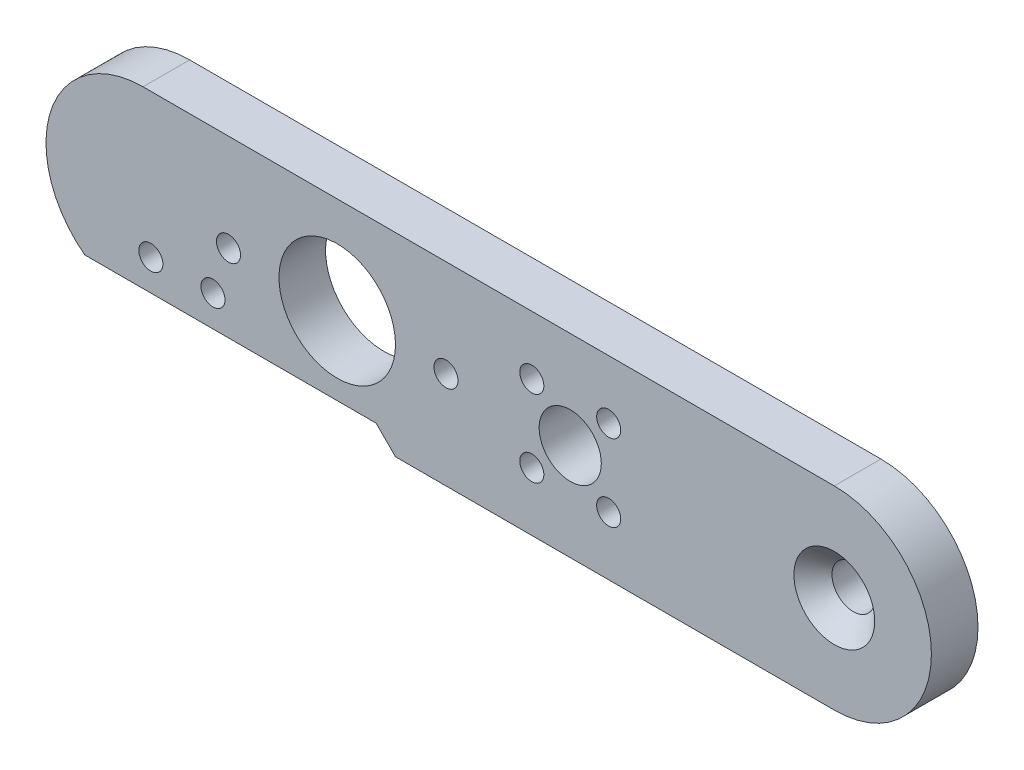
ISO-10303-21;
HEADER;
FILE_DESCRIPTION(('STEP AP214'),'2;1');
FILE_NAME('part.step','',(''),(''),'','','');
FILE_SCHEMA(('AUTOMOTIVE_DESIGN { 1 0 10303 214 1 1 1 1 }'));
ENDSEC;
DATA;
#1=APPLICATION_CONTEXT('core data for automotive mechanical design processes');
#2=APPLICATION_PROTOCOL_DEFINITION('international standard','automotive_design',2000,#1);
#3=PRODUCT_CONTEXT('',#1,'mechanical');
#4=PRODUCT('Part','Part','',(#3));
#5=PRODUCT_RELATED_PRODUCT_CATEGORY('part','',(#4));
#6=PRODUCT_DEFINITION_FORMATION('','',#4);
#7=PRODUCT_DEFINITION_CONTEXT('part definition',#1,'design');
#8=PRODUCT_DEFINITION('design','',#6,#7);
#9=PRODUCT_DEFINITION_SHAPE('','',#8);
#10=(LENGTH_UNIT() NAMED_UNIT(*) SI_UNIT(.MILLI.,.METRE.));
#11=(NAMED_UNIT(*) PLANE_ANGLE_UNIT() SI_UNIT($,.RADIAN.));
#12=(NAMED_UNIT(*) SI_UNIT($,.STERADIAN.) SOLID_ANGLE_UNIT());
#13=UNCERTAINTY_MEASURE_WITH_UNIT(LENGTH_MEASURE(1.E-05),#10,'distance_accuracy_value','');
#14=(GEOMETRIC_REPRESENTATION_CONTEXT(3) GLOBAL_UNCERTAINTY_ASSIGNED_CONTEXT((#13)) GLOBAL_UNIT_ASSIGNED_CONTEXT((#10,
#11,#12)) REPRESENTATION_CONTEXT('',''));
#15=CARTESIAN_POINT('',(0.,0.,0.));
#16=DIRECTION('',(0.,0.,1.));
#17=DIRECTION('',(1.,0.,0.));
#18=AXIS2_PLACEMENT_3D('',#15,#16,#17);
#19=CARTESIAN_POINT('',(-35.5,-5.99999999999998,0.));
#20=DIRECTION('',(0.,0.,1.));
#21=DIRECTION('',(1.,0.,0.));
#22=AXIS2_PLACEMENT_3D('',#19,#20,#21);
#23=CYLINDRICAL_SURFACE('',#22,1.55);
#24=CARTESIAN_POINT('',(-35.5,-5.99999999999998,6.));
#25=DIRECTION('',(0.,0.,1.));
#26=DIRECTION('',(1.,0.,0.));
#27=AXIS2_PLACEMENT_3D('',#24,#25,#26);
#28=CIRCLE('',#27,1.55);
#29=CARTESIAN_POINT('',(-33.95,-5.99999999999998,6.));
#30=VERTEX_POINT('',#29);
#31=EDGE_CURVE('E143',#30,#30,#28,.T.);
#32=ORIENTED_EDGE('',*,*,#31,.T.);
#33=EDGE_LOOP('',(#32));
#34=FACE_BOUND('',#33,.T.);
#35=CARTESIAN_POINT('',(-35.5,-5.99999999999998,3.));
#36=DIRECTION('',(0.,0.,-1.));
#37=DIRECTION('',(-1.,0.,0.));
#38=AXIS2_PLACEMENT_3D('',#35,#36,#37);
#39=CIRCLE('',#38,1.55);
#40=CARTESIAN_POINT('',(-37.05,-5.99999999999998,3.));
#41=VERTEX_POINT('',#40);
#42=EDGE_CURVE('E37',#41,#41,#39,.F.);
#43=ORIENTED_EDGE('',*,*,#42,.F.);
#44=EDGE_LOOP('',(#43));
#45=FACE_BOUND('',#44,.T.);
#46=ADVANCED_FACE('F33',(#34,#45),#23,.F.);
#47=CARTESIAN_POINT('',(-43.5,-5.99999999999998,0.));
#48=DIRECTION('',(0.,0.,1.));
#49=DIRECTION('',(1.,0.,0.));
#50=AXIS2_PLACEMENT_3D('',#47,#48,#49);
#51=CYLINDRICAL_SURFACE('',#50,1.55);
#52=CARTESIAN_POINT('',(-43.5,-5.99999999999998,6.));
#53=DIRECTION('',(0.,0.,1.));
#54=DIRECTION('',(1.,0.,0.));
#55=AXIS2_PLACEMENT_3D('',#52,#53,#54);
#56=CIRCLE('',#55,1.55);
#57=CARTESIAN_POINT('',(-41.95,-5.99999999999998,6.));
#58=VERTEX_POINT('',#57);
#59=EDGE_CURVE('E158',#58,#58,#56,.T.);
#60=ORIENTED_EDGE('',*,*,#59,.T.);
#61=EDGE_LOOP('',(#60));
#62=FACE_BOUND('',#61,.T.);
#63=CARTESIAN_POINT('',(-43.5,-5.99999999999998,3.));
#64=DIRECTION('',(0.,0.,-1.));
#65=DIRECTION('',(-1.,0.,0.));
#66=AXIS2_PLACEMENT_3D('',#63,#64,#65);
#67=CIRCLE('',#66,1.55);
#68=CARTESIAN_POINT('',(-45.05,-5.99999999999998,3.));
#69=VERTEX_POINT('',#68);
#70=EDGE_CURVE('E137',#69,#69,#67,.F.);
#71=ORIENTED_EDGE('',*,*,#70,.F.);
#72=EDGE_LOOP('',(#71));
#73=FACE_BOUND('',#72,.T.);
#74=ADVANCED_FACE('F245',(#62,#73),#51,.F.);
#75=CARTESIAN_POINT('',(-44.5,0.,6.));
#76=DIRECTION('',(0.,0.,1.));
#77=DIRECTION('',(1.,0.,0.));
#78=AXIS2_PLACEMENT_3D('',#75,#76,#77);
#79=PLANE('',#78);
#80=ORIENTED_EDGE('',*,*,#59,.F.);
#81=EDGE_LOOP('',(#80));
#82=FACE_BOUND('',#81,.T.);
#83=ORIENTED_EDGE('',*,*,#31,.F.);
#84=EDGE_LOOP('',(#83));
#85=FACE_BOUND('',#84,.T.);
#86=CARTESIAN_POINT('',(44.5,0.,6.));
#87=DIRECTION('',(0.,0.,1.));
#88=DIRECTION('',(1.,0.,0.));
#89=AXIS2_PLACEMENT_3D('',#86,#87,#88);
#90=CIRCLE('',#89,5.2);
#91=CARTESIAN_POINT('',(49.7,0.,6.));
#92=VERTEX_POINT('',#91);
#93=EDGE_CURVE('E161',#92,#92,#90,.T.);
#94=ORIENTED_EDGE('',*,*,#93,.F.);
#95=EDGE_LOOP('',(#94));
#96=FACE_BOUND('',#95,.T.);
#97=CARTESIAN_POINT('',(-33.5,0.,6.));
#98=DIRECTION('',(0.,0.,1.));
#99=DIRECTION('',(1.,0.,0.));
#100=AXIS2_PLACEMENT_3D('',#97,#98,#99);
#101=CIRCLE('',#100,1.55);
#102=CARTESIAN_POINT('',(-31.95,0.,6.));
#103=VERTEX_POINT('',#102);
#104=EDGE_CURVE('E179',#103,#103,#101,.T.);
#105=ORIENTED_EDGE('',*,*,#104,.F.);
#106=EDGE_LOOP('',(#105));
#107=FACE_BOUND('',#106,.T.);
#108=CARTESIAN_POINT('',(15.4497474683058,-4.94974746830584,6.));
#109=DIRECTION('',(0.,0.,1.));
#110=DIRECTION('',(1.,0.,0.));
#111=AXIS2_PLACEMENT_3D('',#108,#109,#110);
#112=CIRCLE('',#111,1.55);
#113=CARTESIAN_POINT('',(16.9997474683058,-4.94974746830584,6.));
#114=VERTEX_POINT('',#113);
#115=EDGE_CURVE('E191',#114,#114,#112,.T.);
#116=ORIENTED_EDGE('',*,*,#115,.F.);
#117=EDGE_LOOP('',(#116));
#118=FACE_BOUND('',#117,.T.);
#119=CARTESIAN_POINT('',(5.55025253169417,4.94974746830584,6.));
#120=DIRECTION('',(0.,0.,1.));
#121=DIRECTION('',(-1.,0.,0.));
#122=AXIS2_PLACEMENT_3D('',#119,#120,#121);
#123=CIRCLE('',#122,1.55);
#124=CARTESIAN_POINT('',(4.00025253169417,4.94974746830584,6.));
#125=VERTEX_POINT('',#124);
#126=EDGE_CURVE('E203',#125,#125,#123,.T.);
#127=ORIENTED_EDGE('',*,*,#126,.F.);
#128=EDGE_LOOP('',(#127));
#129=FACE_BOUND('',#128,.T.);
#130=CARTESIAN_POINT('',(10.5,0.,6.));
#131=DIRECTION('',(0.,0.,1.));
#132=DIRECTION('',(1.,0.,0.));
#133=AXIS2_PLACEMENT_3D('',#130,#131,#132);
#134=CIRCLE('',#133,4.);
#135=CARTESIAN_POINT('',(14.5,0.,6.));
#136=VERTEX_POINT('',#135);
#137=EDGE_CURVE('E125',#136,#136,#134,.T.);
#138=ORIENTED_EDGE('',*,*,#137,.F.);
#139=EDGE_LOOP('',(#138));
#140=FACE_BOUND('',#139,.T.);
#141=CARTESIAN_POINT('',(-44.5,0.,6.));
#142=DIRECTION('',(0.,0.,1.));
#143=DIRECTION('',(1.,0.,0.));
#144=AXIS2_PLACEMENT_3D('',#141,#142,#143);
#145=CIRCLE('',#144,12.5);
#146=CARTESIAN_POINT('',(-44.5,12.5,6.));
#147=VERTEX_POINT('',#146);
#148=CARTESIAN_POINT('',(-52.,-10.,6.));
#149=VERTEX_POINT('',#148);
#150=EDGE_CURVE('E132',#147,#149,#145,.T.);
#151=ORIENTED_EDGE('',*,*,#150,.T.);
#152=DIRECTION('',(1.,0.,0.));
#153=VECTOR('',#152,1.);
#154=CARTESIAN_POINT('',(-52.,-10.,6.));
#155=LINE('',#154,#153);
#156=CARTESIAN_POINT('',(-14.5,-10.,6.));
#157=VERTEX_POINT('',#156);
#158=EDGE_CURVE('E89',#149,#157,#155,.T.);
#159=ORIENTED_EDGE('',*,*,#158,.T.);
#160=DIRECTION('',(0.707106781186546,-0.707106781186549,0.));
#161=VECTOR('',#160,1.);
#162=CARTESIAN_POINT('',(-14.5,-10.,6.));
#163=LINE('',#162,#161);
#164=CARTESIAN_POINT('',(-12.,-12.5,6.));
#165=VERTEX_POINT('',#164);
#166=EDGE_CURVE('E103',#157,#165,#163,.T.);
#167=ORIENTED_EDGE('',*,*,#166,.T.);
#168=DIRECTION('',(1.,0.,0.));
#169=VECTOR('',#168,1.);
#170=CARTESIAN_POINT('',(-12.,-12.5,6.));
#171=LINE('',#170,#169);
#172=CARTESIAN_POINT('',(44.5,-12.5,6.));
#173=VERTEX_POINT('',#172);
#174=EDGE_CURVE('E96',#165,#173,#171,.T.);
#175=ORIENTED_EDGE('',*,*,#174,.T.);
#176=CARTESIAN_POINT('',(44.5,0.,6.));
#177=DIRECTION('',(0.,0.,1.));
#178=DIRECTION('',(1.,0.,0.));
#179=AXIS2_PLACEMENT_3D('',#176,#177,#178);
#180=CIRCLE('',#179,12.5);
#181=CARTESIAN_POINT('',(44.5,12.5,6.));
#182=VERTEX_POINT('',#181);
#183=EDGE_CURVE('E101',#173,#182,#180,.T.);
#184=ORIENTED_EDGE('',*,*,#183,.T.);
#185=DIRECTION('',(-1.,0.,0.));
#186=VECTOR('',#185,1.);
#187=CARTESIAN_POINT('',(-44.5,12.5,6.));
#188=LINE('',#187,#186);
#189=EDGE_CURVE('E52',#182,#147,#188,.T.);
#190=ORIENTED_EDGE('',*,*,#189,.T.);
#191=EDGE_LOOP('',(#151,#159,#167,#175,#184,#190));
#192=FACE_BOUND('',#191,.T.);
#193=CARTESIAN_POINT('',(15.4497474683058,4.94974746830584,6.));
#194=DIRECTION('',(0.,0.,1.));
#195=DIRECTION('',(1.,0.,0.));
#196=AXIS2_PLACEMENT_3D('',#193,#194,#195);
#197=CIRCLE('',#196,1.55);
#198=CARTESIAN_POINT('',(16.9997474683058,4.94974746830584,6.));
#199=VERTEX_POINT('',#198);
#200=EDGE_CURVE('E209',#199,#199,#197,.T.);
#201=ORIENTED_EDGE('',*,*,#200,.F.);
#202=EDGE_LOOP('',(#201));
#203=FACE_BOUND('',#202,.T.);
#204=CARTESIAN_POINT('',(5.5502525316942,-4.94974746830588,6.));
#205=DIRECTION('',(0.,0.,1.));
#206=DIRECTION('',(1.,0.,0.));
#207=AXIS2_PLACEMENT_3D('',#204,#205,#206);
#208=CIRCLE('',#207,1.55);
#209=CARTESIAN_POINT('',(7.10025253169421,-4.94974746830588,6.));
#210=VERTEX_POINT('',#209);
#211=EDGE_CURVE('E197',#210,#210,#208,.T.);
#212=ORIENTED_EDGE('',*,*,#211,.F.);
#213=EDGE_LOOP('',(#212));
#214=FACE_BOUND('',#213,.T.);
#215=CARTESIAN_POINT('',(-19.5,0.,6.));
#216=DIRECTION('',(0.,0.,1.));
#217=DIRECTION('',(1.,0.,0.));
#218=AXIS2_PLACEMENT_3D('',#215,#216,#217);
#219=CIRCLE('',#218,7.5);
#220=CARTESIAN_POINT('',(-12.,0.,6.));
#221=VERTEX_POINT('',#220);
#222=EDGE_CURVE('E185',#221,#221,#219,.T.);
#223=ORIENTED_EDGE('',*,*,#222,.F.);
#224=EDGE_LOOP('',(#223));
#225=FACE_BOUND('',#224,.T.);
#226=CARTESIAN_POINT('',(-5.5,0.,6.));
#227=DIRECTION('',(0.,0.,1.));
#228=DIRECTION('',(1.,0.,0.));
#229=AXIS2_PLACEMENT_3D('',#226,#227,#228);
#230=CIRCLE('',#229,1.55);
#231=CARTESIAN_POINT('',(-3.95,0.,6.));
#232=VERTEX_POINT('',#231);
#233=EDGE_CURVE('E173',#232,#232,#230,.T.);
#234=ORIENTED_EDGE('',*,*,#233,.F.);
#235=EDGE_LOOP('',(#234));
#236=FACE_BOUND('',#235,.T.);
#237=ADVANCED_FACE('F98',(#82,#85,#96,#107,#118,#129,#140,#192,#203,#214,#225,#236),#79,.T.);
#238=CARTESIAN_POINT('',(-44.5,0.,0.));
#239=DIRECTION('',(0.,0.,1.));
#240=DIRECTION('',(1.,0.,0.));
#241=AXIS2_PLACEMENT_3D('',#238,#239,#240);
#242=PLANE('',#241);
#243=CARTESIAN_POINT('',(-43.5,-5.99999999999998,0.));
#244=DIRECTION('',(0.,0.,-1.));
#245=DIRECTION('',(-1.,0.,0.));
#246=AXIS2_PLACEMENT_3D('',#243,#244,#245);
#247=CIRCLE('',#246,3.);
#248=CARTESIAN_POINT('',(-46.5,-5.99999999999998,0.));
#249=VERTEX_POINT('',#248);
#250=EDGE_CURVE('E145',#249,#249,#247,.T.);
#251=ORIENTED_EDGE('',*,*,#250,.F.);
#252=EDGE_LOOP('',(#251));
#253=FACE_BOUND('',#252,.T.);
#254=CARTESIAN_POINT('',(-35.5,-5.99999999999998,0.));
#255=DIRECTION('',(0.,0.,-1.));
#256=DIRECTION('',(-1.,0.,0.));
#257=AXIS2_PLACEMENT_3D('',#254,#255,#256);
#258=CIRCLE('',#257,3.);
#259=CARTESIAN_POINT('',(-38.5,-5.99999999999998,0.));
#260=VERTEX_POINT('',#259);
#261=EDGE_CURVE('E155',#260,#260,#258,.T.);
#262=ORIENTED_EDGE('',*,*,#261,.F.);
#263=EDGE_LOOP('',(#262));
#264=FACE_BOUND('',#263,.T.);
#265=CARTESIAN_POINT('',(44.5,0.,0.));
#266=DIRECTION('',(0.,0.,1.));
#267=DIRECTION('',(1.,0.,0.));
#268=AXIS2_PLACEMENT_3D('',#265,#266,#267);
#269=CIRCLE('',#268,2.75);
#270=CARTESIAN_POINT('',(47.25,0.,0.));
#271=VERTEX_POINT('',#270);
#272=EDGE_CURVE('E169',#271,#271,#269,.T.);
#273=ORIENTED_EDGE('',*,*,#272,.T.);
#274=EDGE_LOOP('',(#273));
#275=FACE_BOUND('',#274,.T.);
#276=CARTESIAN_POINT('',(-44.5,0.,0.));
#277=DIRECTION('',(0.,0.,1.));
#278=DIRECTION('',(1.,0.,0.));
#279=AXIS2_PLACEMENT_3D('',#276,#277,#278);
#280=CIRCLE('',#279,12.5);
#281=CARTESIAN_POINT('',(-44.5,12.5,0.));
#282=VERTEX_POINT('',#281);
#283=CARTESIAN_POINT('',(-52.,-10.,0.));
#284=VERTEX_POINT('',#283);
#285=EDGE_CURVE('E121',#282,#284,#280,.T.);
#286=ORIENTED_EDGE('',*,*,#285,.F.);
#287=DIRECTION('',(-1.,0.,0.));
#288=VECTOR('',#287,1.);
#289=CARTESIAN_POINT('',(-44.5,12.5,0.));
#290=LINE('',#289,#288);
#291=CARTESIAN_POINT('',(44.5,12.5,0.));
#292=VERTEX_POINT('',#291);
#293=EDGE_CURVE('E81',#292,#282,#290,.T.);
#294=ORIENTED_EDGE('',*,*,#293,.F.);
#295=CARTESIAN_POINT('',(44.5,0.,0.));
#296=DIRECTION('',(0.,0.,1.));
#297=DIRECTION('',(1.,0.,0.));
#298=AXIS2_PLACEMENT_3D('',#295,#296,#297);
#299=CIRCLE('',#298,12.5);
#300=CARTESIAN_POINT('',(44.5,-12.5,0.));
#301=VERTEX_POINT('',#300);
#302=EDGE_CURVE('E75',#301,#292,#299,.T.);
#303=ORIENTED_EDGE('',*,*,#302,.F.);
#304=DIRECTION('',(1.,0.,0.));
#305=VECTOR('',#304,1.);
#306=CARTESIAN_POINT('',(-12.,-12.5,0.));
#307=LINE('',#306,#305);
#308=CARTESIAN_POINT('',(-12.,-12.5,0.));
#309=VERTEX_POINT('',#308);
#310=EDGE_CURVE('E111',#309,#301,#307,.T.);
#311=ORIENTED_EDGE('',*,*,#310,.F.);
#312=DIRECTION('',(0.707106781186546,-0.707106781186549,0.));
#313=VECTOR('',#312,1.);
#314=CARTESIAN_POINT('',(-14.5,-10.,0.));
#315=LINE('',#314,#313);
#316=CARTESIAN_POINT('',(-14.5,-10.,0.));
#317=VERTEX_POINT('',#316);
#318=EDGE_CURVE('E127',#317,#309,#315,.T.);
#319=ORIENTED_EDGE('',*,*,#318,.F.);
#320=DIRECTION('',(1.,0.,0.));
#321=VECTOR('',#320,1.);
#322=CARTESIAN_POINT('',(-52.,-10.,0.));
#323=LINE('',#322,#321);
#324=EDGE_CURVE('E124',#284,#317,#323,.T.);
#325=ORIENTED_EDGE('',*,*,#324,.F.);
#326=EDGE_LOOP('',(#286,#294,#303,#311,#319,#325));
#327=FACE_BOUND('',#326,.T.);
#328=CARTESIAN_POINT('',(10.5,0.,0.));
#329=DIRECTION('',(0.,0.,1.));
#330=DIRECTION('',(1.,0.,0.));
#331=AXIS2_PLACEMENT_3D('',#328,#329,#330);
#332=CIRCLE('',#331,4.);
#333=CARTESIAN_POINT('',(14.5,0.,0.));
#334=VERTEX_POINT('',#333);
#335=EDGE_CURVE('E212',#334,#334,#332,.T.);
#336=ORIENTED_EDGE('',*,*,#335,.T.);
#337=EDGE_LOOP('',(#336));
#338=FACE_BOUND('',#337,.T.);
#339=CARTESIAN_POINT('',(15.4497474683058,4.94974746830584,0.));
#340=DIRECTION('',(0.,0.,1.));
#341=DIRECTION('',(1.,0.,0.));
#342=AXIS2_PLACEMENT_3D('',#339,#340,#341);
#343=CIRCLE('',#342,1.55);
#344=CARTESIAN_POINT('',(16.9997474683058,4.94974746830584,0.));
#345=VERTEX_POINT('',#344);
#346=EDGE_CURVE('E206',#345,#345,#343,.T.);
#347=ORIENTED_EDGE('',*,*,#346,.T.);
#348=EDGE_LOOP('',(#347));
#349=FACE_BOUND('',#348,.T.);
#350=CARTESIAN_POINT('',(5.55025253169417,4.94974746830584,0.));
#351=DIRECTION('',(0.,0.,1.));
#352=DIRECTION('',(-1.,0.,0.));
#353=AXIS2_PLACEMENT_3D('',#350,#351,#352);
#354=CIRCLE('',#353,1.55);
#355=CARTESIAN_POINT('',(4.00025253169417,4.94974746830584,0.));
#356=VERTEX_POINT('',#355);
#357=EDGE_CURVE('E200',#356,#356,#354,.T.);
#358=ORIENTED_EDGE('',*,*,#357,.T.);
#359=EDGE_LOOP('',(#358));
#360=FACE_BOUND('',#359,.T.);
#361=CARTESIAN_POINT('',(5.5502525316942,-4.94974746830588,0.));
#362=DIRECTION('',(0.,0.,1.));
#363=DIRECTION('',(1.,0.,0.));
#364=AXIS2_PLACEMENT_3D('',#361,#362,#363);
#365=CIRCLE('',#364,1.55);
#366=CARTESIAN_POINT('',(7.10025253169421,-4.94974746830588,0.));
#367=VERTEX_POINT('',#366);
#368=EDGE_CURVE('E194',#367,#367,#365,.T.);
#369=ORIENTED_EDGE('',*,*,#368,.T.);
#370=EDGE_LOOP('',(#369));
#371=FACE_BOUND('',#370,.T.);
#372=CARTESIAN_POINT('',(15.4497474683058,-4.94974746830584,0.));
#373=DIRECTION('',(0.,0.,1.));
#374=DIRECTION('',(1.,0.,0.));
#375=AXIS2_PLACEMENT_3D('',#372,#373,#374);
#376=CIRCLE('',#375,1.55);
#377=CARTESIAN_POINT('',(16.9997474683058,-4.94974746830584,0.));
#378=VERTEX_POINT('',#377);
#379=EDGE_CURVE('E188',#378,#378,#376,.T.);
#380=ORIENTED_EDGE('',*,*,#379,.T.);
#381=EDGE_LOOP('',(#380));
#382=FACE_BOUND('',#381,.T.);
#383=CARTESIAN_POINT('',(-19.5,0.,0.));
#384=DIRECTION('',(0.,0.,1.));
#385=DIRECTION('',(1.,0.,0.));
#386=AXIS2_PLACEMENT_3D('',#383,#384,#385);
#387=CIRCLE('',#386,7.5);
#388=CARTESIAN_POINT('',(-12.,0.,0.));
#389=VERTEX_POINT('',#388);
#390=EDGE_CURVE('E182',#389,#389,#387,.T.);
#391=ORIENTED_EDGE('',*,*,#390,.T.);
#392=EDGE_LOOP('',(#391));
#393=FACE_BOUND('',#392,.T.);
#394=CARTESIAN_POINT('',(-33.5,0.,0.));
#395=DIRECTION('',(0.,0.,1.));
#396=DIRECTION('',(1.,0.,0.));
#397=AXIS2_PLACEMENT_3D('',#394,#395,#396);
#398=CIRCLE('',#397,1.55);
#399=CARTESIAN_POINT('',(-31.95,0.,0.));
#400=VERTEX_POINT('',#399);
#401=EDGE_CURVE('E176',#400,#400,#398,.T.);
#402=ORIENTED_EDGE('',*,*,#401,.T.);
#403=EDGE_LOOP('',(#402));
#404=FACE_BOUND('',#403,.T.);
#405=CARTESIAN_POINT('',(-5.5,0.,0.));
#406=DIRECTION('',(0.,0.,1.));
#407=DIRECTION('',(1.,0.,0.));
#408=AXIS2_PLACEMENT_3D('',#405,#406,#407);
#409=CIRCLE('',#408,1.55);
#410=CARTESIAN_POINT('',(-3.95,0.,0.));
#411=VERTEX_POINT('',#410);
#412=EDGE_CURVE('E172',#411,#411,#409,.T.);
#413=ORIENTED_EDGE('',*,*,#412,.T.);
#414=EDGE_LOOP('',(#413));
#415=FACE_BOUND('',#414,.T.);
#416=ADVANCED_FACE('F228',(#253,#264,#275,#327,#338,#349,#360,#371,#382,#393,#404,#415),#242,.F.);
#417=CARTESIAN_POINT('',(-44.5,0.,6.));
#418=DIRECTION('',(0.,0.,-1.));
#419=DIRECTION('',(-1.,0.,0.));
#420=AXIS2_PLACEMENT_3D('',#417,#418,#419);
#421=CYLINDRICAL_SURFACE('',#420,12.5);
#422=ORIENTED_EDGE('',*,*,#285,.T.);
#423=DIRECTION('',(0.,0.,-1.));
#424=VECTOR('',#423,1.);
#425=CARTESIAN_POINT('',(-52.,-10.,6.));
#426=LINE('',#425,#424);
#427=EDGE_CURVE('E11',#149,#284,#426,.T.);
#428=ORIENTED_EDGE('',*,*,#427,.F.);
#429=ORIENTED_EDGE('',*,*,#150,.F.);
#430=DIRECTION('',(0.,0.,-1.));
#431=VECTOR('',#430,1.);
#432=CARTESIAN_POINT('',(-44.5,12.5,6.));
#433=LINE('',#432,#431);
#434=EDGE_CURVE('E117',#147,#282,#433,.T.);
#435=ORIENTED_EDGE('',*,*,#434,.T.);
#436=EDGE_LOOP('',(#422,#428,#429,#435));
#437=FACE_BOUND('',#436,.T.);
#438=ADVANCED_FACE('F35',(#437),#421,.T.);
#439=CARTESIAN_POINT('',(-52.,-10.,6.));
#440=DIRECTION('',(0.,1.,0.));
#441=DIRECTION('',(-1.,0.,0.));
#442=AXIS2_PLACEMENT_3D('',#439,#440,#441);
#443=PLANE('',#442);
#444=ORIENTED_EDGE('',*,*,#324,.T.);
#445=DIRECTION('',(0.,0.,-1.));
#446=VECTOR('',#445,1.);
#447=CARTESIAN_POINT('',(-14.5,-10.,6.));
#448=LINE('',#447,#446);
#449=EDGE_CURVE('E43',#157,#317,#448,.T.);
#450=ORIENTED_EDGE('',*,*,#449,.F.);
#451=ORIENTED_EDGE('',*,*,#158,.F.);
#452=ORIENTED_EDGE('',*,*,#427,.T.);
#453=EDGE_LOOP('',(#444,#450,#451,#452));
#454=FACE_BOUND('',#453,.T.);
#455=ADVANCED_FACE('F222',(#454),#443,.F.);
#456=CARTESIAN_POINT('',(-14.5,-10.,6.));
#457=DIRECTION('',(0.707106781186549,0.707106781186546,0.));
#458=DIRECTION('',(-0.707106781186546,0.707106781186549,0.));
#459=AXIS2_PLACEMENT_3D('',#456,#457,#458);
#460=PLANE('',#459);
#461=ORIENTED_EDGE('',*,*,#318,.T.);
#462=DIRECTION('',(0.,0.,-1.));
#463=VECTOR('',#462,1.);
#464=CARTESIAN_POINT('',(-12.,-12.5,6.));
#465=LINE('',#464,#463);
#466=EDGE_CURVE('E112',#165,#309,#465,.T.);
#467=ORIENTED_EDGE('',*,*,#466,.F.);
#468=ORIENTED_EDGE('',*,*,#166,.F.);
#469=ORIENTED_EDGE('',*,*,#449,.T.);
#470=EDGE_LOOP('',(#461,#467,#468,#469));
#471=FACE_BOUND('',#470,.T.);
#472=ADVANCED_FACE('F225',(#471),#460,.F.);
#473=CARTESIAN_POINT('',(-12.,-12.5,6.));
#474=DIRECTION('',(0.,1.,0.));
#475=DIRECTION('',(-1.,0.,0.));
#476=AXIS2_PLACEMENT_3D('',#473,#474,#475);
#477=PLANE('',#476);
#478=ORIENTED_EDGE('',*,*,#310,.T.);
#479=DIRECTION('',(0.,0.,-1.));
#480=VECTOR('',#479,1.);
#481=CARTESIAN_POINT('',(44.5,-12.5,6.));
#482=LINE('',#481,#480);
#483=EDGE_CURVE('E108',#173,#301,#482,.T.);
#484=ORIENTED_EDGE('',*,*,#483,.F.);
#485=ORIENTED_EDGE('',*,*,#174,.F.);
#486=ORIENTED_EDGE('',*,*,#466,.T.);
#487=EDGE_LOOP('',(#478,#484,#485,#486));
#488=FACE_BOUND('',#487,.T.);
#489=ADVANCED_FACE('F109',(#488),#477,.F.);
#490=CARTESIAN_POINT('',(44.5,0.,6.));
#491=DIRECTION('',(0.,0.,-1.));
#492=DIRECTION('',(-1.,0.,0.));
#493=AXIS2_PLACEMENT_3D('',#490,#491,#492);
#494=CYLINDRICAL_SURFACE('',#493,12.5);
#495=ORIENTED_EDGE('',*,*,#302,.T.);
#496=DIRECTION('',(0.,0.,-1.));
#497=VECTOR('',#496,1.);
#498=CARTESIAN_POINT('',(44.5,12.5,6.));
#499=LINE('',#498,#497);
#500=EDGE_CURVE('E113',#182,#292,#499,.T.);
#501=ORIENTED_EDGE('',*,*,#500,.F.);
#502=ORIENTED_EDGE('',*,*,#183,.F.);
#503=ORIENTED_EDGE('',*,*,#483,.T.);
#504=EDGE_LOOP('',(#495,#501,#502,#503));
#505=FACE_BOUND('',#504,.T.);
#506=ADVANCED_FACE('F115',(#505),#494,.T.);
#507=CARTESIAN_POINT('',(-44.5,12.5,6.));
#508=DIRECTION('',(0.,-1.,0.));
#509=DIRECTION('',(1.,0.,0.));
#510=AXIS2_PLACEMENT_3D('',#507,#508,#509);
#511=PLANE('',#510);
#512=ORIENTED_EDGE('',*,*,#293,.T.);
#513=ORIENTED_EDGE('',*,*,#434,.F.);
#514=ORIENTED_EDGE('',*,*,#189,.F.);
#515=ORIENTED_EDGE('',*,*,#500,.T.);
#516=EDGE_LOOP('',(#512,#513,#514,#515));
#517=FACE_BOUND('',#516,.T.);
#518=ADVANCED_FACE('F231',(#517),#511,.F.);
#519=CARTESIAN_POINT('',(10.5,0.,6.));
#520=DIRECTION('',(0.,0.,-1.));
#521=DIRECTION('',(-1.,0.,0.));
#522=AXIS2_PLACEMENT_3D('',#519,#520,#521);
#523=CYLINDRICAL_SURFACE('',#522,4.);
#524=ORIENTED_EDGE('',*,*,#137,.T.);
#525=EDGE_LOOP('',(#524));
#526=FACE_BOUND('',#525,.T.);
#527=ORIENTED_EDGE('',*,*,#335,.F.);
#528=EDGE_LOOP('',(#527));
#529=FACE_BOUND('',#528,.T.);
#530=ADVANCED_FACE('F233',(#526,#529),#523,.F.);
#531=CARTESIAN_POINT('',(15.4497474683058,4.94974746830584,6.));
#532=DIRECTION('',(0.,0.,-1.));
#533=DIRECTION('',(-1.,0.,0.));
#534=AXIS2_PLACEMENT_3D('',#531,#532,#533);
#535=CYLINDRICAL_SURFACE('',#534,1.55);
#536=ORIENTED_EDGE('',*,*,#200,.T.);
#537=EDGE_LOOP('',(#536));
#538=FACE_BOUND('',#537,.T.);
#539=ORIENTED_EDGE('',*,*,#346,.F.);
#540=EDGE_LOOP('',(#539));
#541=FACE_BOUND('',#540,.T.);
#542=ADVANCED_FACE('F239',(#538,#541),#535,.F.);
#543=CARTESIAN_POINT('',(5.55025253169417,4.94974746830584,6.));
#544=DIRECTION('',(0.,0.,-1.));
#545=DIRECTION('',(-1.,0.,0.));
#546=AXIS2_PLACEMENT_3D('',#543,#544,#545);
#547=CYLINDRICAL_SURFACE('',#546,1.55);
#548=ORIENTED_EDGE('',*,*,#126,.T.);
#549=EDGE_LOOP('',(#548));
#550=FACE_BOUND('',#549,.T.);
#551=ORIENTED_EDGE('',*,*,#357,.F.);
#552=EDGE_LOOP('',(#551));
#553=FACE_BOUND('',#552,.T.);
#554=ADVANCED_FACE('F284',(#550,#553),#547,.F.);
#555=CARTESIAN_POINT('',(5.5502525316942,-4.94974746830588,6.));
#556=DIRECTION('',(0.,0.,-1.));
#557=DIRECTION('',(-1.,0.,0.));
#558=AXIS2_PLACEMENT_3D('',#555,#556,#557);
#559=CYLINDRICAL_SURFACE('',#558,1.55);
#560=ORIENTED_EDGE('',*,*,#211,.T.);
#561=EDGE_LOOP('',(#560));
#562=FACE_BOUND('',#561,.T.);
#563=ORIENTED_EDGE('',*,*,#368,.F.);
#564=EDGE_LOOP('',(#563));
#565=FACE_BOUND('',#564,.T.);
#566=ADVANCED_FACE('F280',(#562,#565),#559,.F.);
#567=CARTESIAN_POINT('',(15.4497474683058,-4.94974746830584,6.));
#568=DIRECTION('',(0.,0.,-1.));
#569=DIRECTION('',(-1.,0.,0.));
#570=AXIS2_PLACEMENT_3D('',#567,#568,#569);
#571=CYLINDRICAL_SURFACE('',#570,1.55);
#572=ORIENTED_EDGE('',*,*,#115,.T.);
#573=EDGE_LOOP('',(#572));
#574=FACE_BOUND('',#573,.T.);
#575=ORIENTED_EDGE('',*,*,#379,.F.);
#576=EDGE_LOOP('',(#575));
#577=FACE_BOUND('',#576,.T.);
#578=ADVANCED_FACE('F276',(#574,#577),#571,.F.);
#579=CARTESIAN_POINT('',(-19.5,0.,6.));
#580=DIRECTION('',(0.,0.,-1.));
#581=DIRECTION('',(-1.,0.,0.));
#582=AXIS2_PLACEMENT_3D('',#579,#580,#581);
#583=CYLINDRICAL_SURFACE('',#582,7.5);
#584=ORIENTED_EDGE('',*,*,#222,.T.);
#585=EDGE_LOOP('',(#584));
#586=FACE_BOUND('',#585,.T.);
#587=ORIENTED_EDGE('',*,*,#390,.F.);
#588=EDGE_LOOP('',(#587));
#589=FACE_BOUND('',#588,.T.);
#590=ADVANCED_FACE('F272',(#586,#589),#583,.F.);
#591=CARTESIAN_POINT('',(-33.5,0.,6.));
#592=DIRECTION('',(0.,0.,-1.));
#593=DIRECTION('',(-1.,0.,0.));
#594=AXIS2_PLACEMENT_3D('',#591,#592,#593);
#595=CYLINDRICAL_SURFACE('',#594,1.55);
#596=ORIENTED_EDGE('',*,*,#104,.T.);
#597=EDGE_LOOP('',(#596));
#598=FACE_BOUND('',#597,.T.);
#599=ORIENTED_EDGE('',*,*,#401,.F.);
#600=EDGE_LOOP('',(#599));
#601=FACE_BOUND('',#600,.T.);
#602=ADVANCED_FACE('F268',(#598,#601),#595,.F.);
#603=CARTESIAN_POINT('',(-5.5,0.,6.));
#604=DIRECTION('',(0.,0.,-1.));
#605=DIRECTION('',(-1.,0.,0.));
#606=AXIS2_PLACEMENT_3D('',#603,#604,#605);
#607=CYLINDRICAL_SURFACE('',#606,1.55);
#608=ORIENTED_EDGE('',*,*,#233,.T.);
#609=EDGE_LOOP('',(#608));
#610=FACE_BOUND('',#609,.T.);
#611=ORIENTED_EDGE('',*,*,#412,.F.);
#612=EDGE_LOOP('',(#611));
#613=FACE_BOUND('',#612,.T.);
#614=ADVANCED_FACE('F264',(#610,#613),#607,.F.);
#615=CARTESIAN_POINT('',(44.5,0.,6.));
#616=DIRECTION('',(0.,0.,1.));
#617=DIRECTION('',(1.,0.,0.));
#618=AXIS2_PLACEMENT_3D('',#615,#616,#617);
#619=CYLINDRICAL_SURFACE('',#618,2.75);
#620=ORIENTED_EDGE('',*,*,#272,.F.);
#621=EDGE_LOOP('',(#620));
#622=FACE_BOUND('',#621,.T.);
#623=CARTESIAN_POINT('',(44.5,0.,3.55));
#624=DIRECTION('',(0.,0.,1.));
#625=DIRECTION('',(1.,0.,0.));
#626=AXIS2_PLACEMENT_3D('',#623,#624,#625);
#627=CIRCLE('',#626,2.75);
#628=CARTESIAN_POINT('',(47.25,0.,3.55));
#629=VERTEX_POINT('',#628);
#630=EDGE_CURVE('E166',#629,#629,#627,.T.);
#631=ORIENTED_EDGE('',*,*,#630,.T.);
#632=EDGE_LOOP('',(#631));
#633=FACE_BOUND('',#632,.T.);
#634=ADVANCED_FACE('F260',(#622,#633),#619,.F.);
#635=CARTESIAN_POINT('',(44.5,0.,6.));
#636=DIRECTION('',(0.,0.,1.));
#637=DIRECTION('',(1.,0.,0.));
#638=AXIS2_PLACEMENT_3D('',#635,#636,#637);
#639=CONICAL_SURFACE('',#638,5.2,0.785398163397448);
#640=ORIENTED_EDGE('',*,*,#630,.F.);
#641=EDGE_LOOP('',(#640));
#642=FACE_BOUND('',#641,.T.);
#643=ORIENTED_EDGE('',*,*,#93,.T.);
#644=EDGE_LOOP('',(#643));
#645=FACE_BOUND('',#644,.T.);
#646=ADVANCED_FACE('F256',(#642,#645),#639,.F.);
#647=CARTESIAN_POINT('',(-43.5,-5.99999999999998,3.));
#648=DIRECTION('',(0.,0.,-1.));
#649=DIRECTION('',(-1.,0.,0.));
#650=AXIS2_PLACEMENT_3D('',#647,#648,#649);
#651=PLANE('',#650);
#652=CARTESIAN_POINT('',(-43.5,-5.99999999999998,3.));
#653=DIRECTION('',(0.,0.,-1.));
#654=DIRECTION('',(-1.,0.,0.));
#655=AXIS2_PLACEMENT_3D('',#652,#653,#654);
#656=CIRCLE('',#655,3.);
#657=CARTESIAN_POINT('',(-46.5,-5.99999999999998,3.));
#658=VERTEX_POINT('',#657);
#659=EDGE_CURVE('E139',#658,#658,#656,.T.);
#660=ORIENTED_EDGE('',*,*,#659,.T.);
#661=EDGE_LOOP('',(#660));
#662=FACE_BOUND('',#661,.T.);
#663=ORIENTED_EDGE('',*,*,#70,.T.);
#664=EDGE_LOOP('',(#663));
#665=FACE_BOUND('',#664,.T.);
#666=ADVANCED_FACE('F259',(#662,#665),#651,.T.);
#667=CARTESIAN_POINT('',(-43.5,-5.99999999999998,3.));
#668=DIRECTION('',(0.,0.,-1.));
#669=DIRECTION('',(-1.,0.,0.));
#670=AXIS2_PLACEMENT_3D('',#667,#668,#669);
#671=CYLINDRICAL_SURFACE('',#670,3.);
#672=ORIENTED_EDGE('',*,*,#659,.F.);
#673=EDGE_LOOP('',(#672));
#674=FACE_BOUND('',#673,.T.);
#675=ORIENTED_EDGE('',*,*,#250,.T.);
#676=EDGE_LOOP('',(#675));
#677=FACE_BOUND('',#676,.T.);
#678=ADVANCED_FACE('F348',(#674,#677),#671,.F.);
#679=CARTESIAN_POINT('',(-35.5,-5.99999999999998,3.));
#680=DIRECTION('',(0.,0.,-1.));
#681=DIRECTION('',(-1.,0.,0.));
#682=AXIS2_PLACEMENT_3D('',#679,#680,#681);
#683=PLANE('',#682);
#684=CARTESIAN_POINT('',(-35.5,-5.99999999999998,3.));
#685=DIRECTION('',(0.,0.,-1.));
#686=DIRECTION('',(-1.,0.,0.));
#687=AXIS2_PLACEMENT_3D('',#684,#685,#686);
#688=CIRCLE('',#687,3.);
#689=CARTESIAN_POINT('',(-38.5,-5.99999999999998,3.));
#690=VERTEX_POINT('',#689);
#691=EDGE_CURVE('E150',#690,#690,#688,.T.);
#692=ORIENTED_EDGE('',*,*,#691,.T.);
#693=EDGE_LOOP('',(#692));
#694=FACE_BOUND('',#693,.T.);
#695=ORIENTED_EDGE('',*,*,#42,.T.);
#696=EDGE_LOOP('',(#695));
#697=FACE_BOUND('',#696,.T.);
#698=ADVANCED_FACE('F343',(#694,#697),#683,.T.);
#699=CARTESIAN_POINT('',(-35.5,-5.99999999999998,3.));
#700=DIRECTION('',(0.,0.,-1.));
#701=DIRECTION('',(-1.,0.,0.));
#702=AXIS2_PLACEMENT_3D('',#699,#700,#701);
#703=CYLINDRICAL_SURFACE('',#702,3.);
#704=ORIENTED_EDGE('',*,*,#691,.F.);
#705=EDGE_LOOP('',(#704));
#706=FACE_BOUND('',#705,.T.);
#707=ORIENTED_EDGE('',*,*,#261,.T.);
#708=EDGE_LOOP('',(#707));
#709=FACE_BOUND('',#708,.T.);
#710=ADVANCED_FACE('F341',(#706,#709),#703,.F.);
#711=CLOSED_SHELL('',(#46,#74,#237,#416,#438,#455,#472,#489,#506,#518,#530,#542,#554,#566,#578,
#590,#602,#614,#634,#646,#666,#678,#698,#710));
#712=MANIFOLD_SOLID_BREP('B2',#711);
#713=ADVANCED_BREP_SHAPE_REPRESENTATION('',(#18,#712),#14);
#714=SHAPE_DEFINITION_REPRESENTATION(#9,#713);
ENDSEC;
END-ISO-10303-21;
